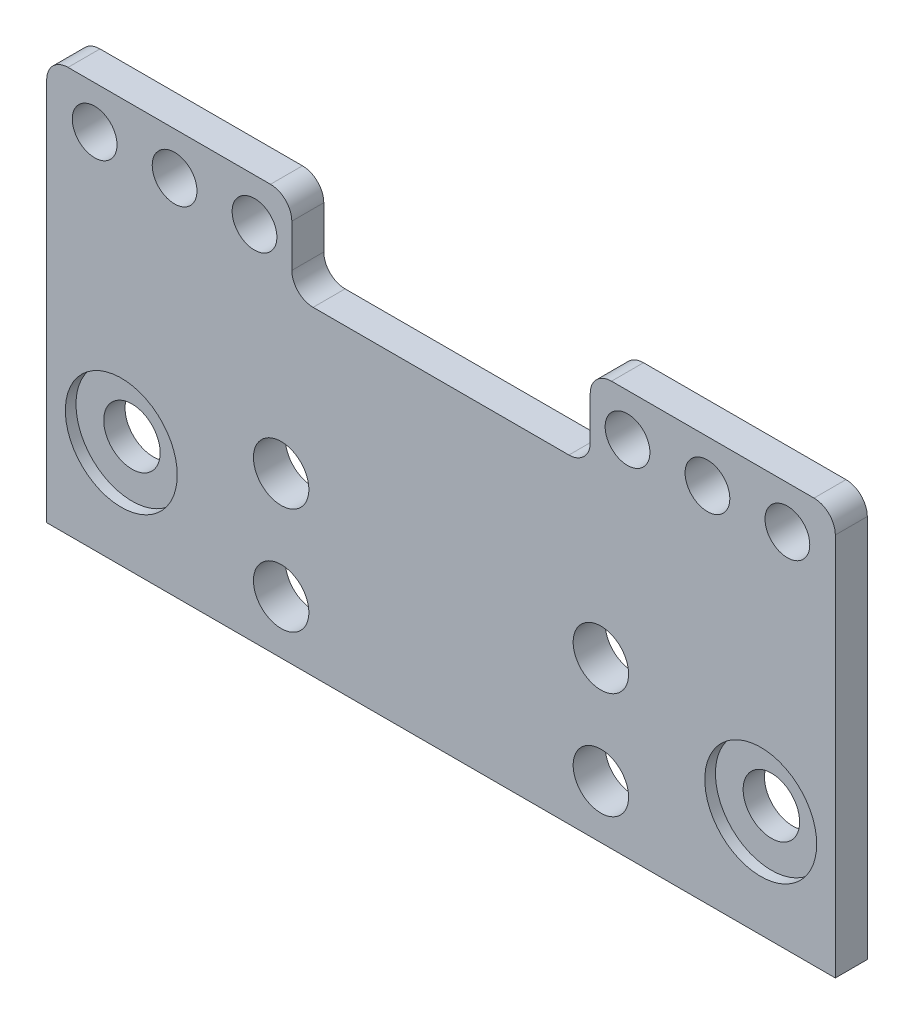
ISO-10303-21;
HEADER;
FILE_DESCRIPTION(('STEP AP214'),'2;1');
FILE_NAME('part.step','',(''),(''),'','','');
FILE_SCHEMA(('AUTOMOTIVE_DESIGN { 1 0 10303 214 1 1 1 1 }'));
ENDSEC;
DATA;
#1=APPLICATION_CONTEXT('core data for automotive mechanical design processes');
#2=APPLICATION_PROTOCOL_DEFINITION('international standard','automotive_design',2000,#1);
#3=PRODUCT_CONTEXT('',#1,'mechanical');
#4=PRODUCT('Part','Part','',(#3));
#5=PRODUCT_RELATED_PRODUCT_CATEGORY('part','',(#4));
#6=PRODUCT_DEFINITION_FORMATION('','',#4);
#7=PRODUCT_DEFINITION_CONTEXT('part definition',#1,'design');
#8=PRODUCT_DEFINITION('design','',#6,#7);
#9=PRODUCT_DEFINITION_SHAPE('','',#8);
#10=(LENGTH_UNIT() NAMED_UNIT(*) SI_UNIT(.MILLI.,.METRE.));
#11=(NAMED_UNIT(*) PLANE_ANGLE_UNIT() SI_UNIT($,.RADIAN.));
#12=(NAMED_UNIT(*) SI_UNIT($,.STERADIAN.) SOLID_ANGLE_UNIT());
#13=UNCERTAINTY_MEASURE_WITH_UNIT(LENGTH_MEASURE(1.E-05),#10,'distance_accuracy_value','');
#14=(GEOMETRIC_REPRESENTATION_CONTEXT(3) GLOBAL_UNCERTAINTY_ASSIGNED_CONTEXT((#13)) GLOBAL_UNIT_ASSIGNED_CONTEXT((#10,
#11,#12)) REPRESENTATION_CONTEXT('',''));
#15=CARTESIAN_POINT('',(0.,0.,0.));
#16=DIRECTION('',(0.,0.,1.));
#17=DIRECTION('',(1.,0.,0.));
#18=AXIS2_PLACEMENT_3D('',#15,#16,#17);
#19=CARTESIAN_POINT('',(-30.,0.,3.));
#20=DIRECTION('',(0.,0.,-1.));
#21=DIRECTION('',(-1.,0.,0.));
#22=AXIS2_PLACEMENT_3D('',#19,#20,#21);
#23=CYLINDRICAL_SURFACE('',#22,2.65);
#24=CARTESIAN_POINT('',(-30.,0.,0.));
#25=DIRECTION('',(0.,0.,1.));
#26=DIRECTION('',(1.,0.,0.));
#27=AXIS2_PLACEMENT_3D('',#24,#25,#26);
#28=CIRCLE('',#27,2.65);
#29=CARTESIAN_POINT('',(-27.35,0.,0.));
#30=VERTEX_POINT('',#29);
#31=EDGE_CURVE('E287',#30,#30,#28,.T.);
#32=ORIENTED_EDGE('',*,*,#31,.F.);
#33=EDGE_LOOP('',(#32));
#34=FACE_BOUND('',#33,.T.);
#35=CARTESIAN_POINT('',(-30.,0.,2.));
#36=DIRECTION('',(0.,0.,1.));
#37=DIRECTION('',(1.,0.,0.));
#38=AXIS2_PLACEMENT_3D('',#35,#36,#37);
#39=CIRCLE('',#38,2.65);
#40=CARTESIAN_POINT('',(-27.35,0.,2.));
#41=VERTEX_POINT('',#40);
#42=EDGE_CURVE('E39',#41,#41,#39,.T.);
#43=ORIENTED_EDGE('',*,*,#42,.T.);
#44=EDGE_LOOP('',(#43));
#45=FACE_BOUND('',#44,.T.);
#46=ADVANCED_FACE('F35',(#34,#45),#23,.F.);
#47=CARTESIAN_POINT('',(30.,0.,3.));
#48=DIRECTION('',(0.,0.,-1.));
#49=DIRECTION('',(-1.,0.,0.));
#50=AXIS2_PLACEMENT_3D('',#47,#48,#49);
#51=CYLINDRICAL_SURFACE('',#50,2.65);
#52=CARTESIAN_POINT('',(30.,0.,0.));
#53=DIRECTION('',(0.,0.,1.));
#54=DIRECTION('',(1.,0.,0.));
#55=AXIS2_PLACEMENT_3D('',#52,#53,#54);
#56=CIRCLE('',#55,2.65);
#57=CARTESIAN_POINT('',(32.65,0.,0.));
#58=VERTEX_POINT('',#57);
#59=EDGE_CURVE('E282',#58,#58,#56,.T.);
#60=ORIENTED_EDGE('',*,*,#59,.F.);
#61=EDGE_LOOP('',(#60));
#62=FACE_BOUND('',#61,.T.);
#63=CARTESIAN_POINT('',(30.,0.,2.));
#64=DIRECTION('',(0.,0.,1.));
#65=DIRECTION('',(1.,0.,0.));
#66=AXIS2_PLACEMENT_3D('',#63,#64,#65);
#67=CIRCLE('',#66,2.65);
#68=CARTESIAN_POINT('',(32.65,0.,2.));
#69=VERTEX_POINT('',#68);
#70=EDGE_CURVE('E244',#69,#69,#67,.T.);
#71=ORIENTED_EDGE('',*,*,#70,.T.);
#72=EDGE_LOOP('',(#71));
#73=FACE_BOUND('',#72,.T.);
#74=ADVANCED_FACE('F386',(#62,#73),#51,.F.);
#75=CARTESIAN_POINT('',(0.,0.,3.));
#76=DIRECTION('',(0.,0.,1.));
#77=DIRECTION('',(1.,0.,0.));
#78=AXIS2_PLACEMENT_3D('',#75,#76,#77);
#79=PLANE('',#78);
#80=CARTESIAN_POINT('',(-30.,0.,3.));
#81=DIRECTION('',(0.,0.,1.));
#82=DIRECTION('',(1.,0.,0.));
#83=AXIS2_PLACEMENT_3D('',#80,#81,#82);
#84=CIRCLE('',#83,5.25);
#85=CARTESIAN_POINT('',(-24.75,0.,3.));
#86=VERTEX_POINT('',#85);
#87=EDGE_CURVE('E261',#86,#86,#84,.T.);
#88=ORIENTED_EDGE('',*,*,#87,.F.);
#89=EDGE_LOOP('',(#88));
#90=FACE_BOUND('',#89,.T.);
#91=CARTESIAN_POINT('',(30.,0.,3.));
#92=DIRECTION('',(0.,0.,1.));
#93=DIRECTION('',(1.,0.,0.));
#94=AXIS2_PLACEMENT_3D('',#91,#92,#93);
#95=CIRCLE('',#94,5.25);
#96=CARTESIAN_POINT('',(35.25,0.,3.));
#97=VERTEX_POINT('',#96);
#98=EDGE_CURVE('E254',#97,#97,#95,.T.);
#99=ORIENTED_EDGE('',*,*,#98,.F.);
#100=EDGE_LOOP('',(#99));
#101=FACE_BOUND('',#100,.T.);
#102=CARTESIAN_POINT('',(-15.,5.,3.));
#103=DIRECTION('',(0.,0.,1.));
#104=DIRECTION('',(-1.,0.,0.));
#105=AXIS2_PLACEMENT_3D('',#102,#103,#104);
#106=CIRCLE('',#105,2.6);
#107=CARTESIAN_POINT('',(-17.6,5.,3.));
#108=VERTEX_POINT('',#107);
#109=EDGE_CURVE('E267',#108,#108,#106,.T.);
#110=ORIENTED_EDGE('',*,*,#109,.F.);
#111=EDGE_LOOP('',(#110));
#112=FACE_BOUND('',#111,.T.);
#113=CARTESIAN_POINT('',(15.,-5.,3.));
#114=DIRECTION('',(0.,0.,1.));
#115=DIRECTION('',(1.,0.,0.));
#116=AXIS2_PLACEMENT_3D('',#113,#114,#115);
#117=CIRCLE('',#116,2.6);
#118=CARTESIAN_POINT('',(17.6,-5.,3.));
#119=VERTEX_POINT('',#118);
#120=EDGE_CURVE('E279',#119,#119,#117,.T.);
#121=ORIENTED_EDGE('',*,*,#120,.F.);
#122=EDGE_LOOP('',(#121));
#123=FACE_BOUND('',#122,.T.);
#124=CARTESIAN_POINT('',(-17.5,24.,3.));
#125=DIRECTION('',(0.,0.,1.));
#126=DIRECTION('',(-1.,0.,0.));
#127=AXIS2_PLACEMENT_3D('',#124,#125,#126);
#128=CIRCLE('',#127,2.1);
#129=CARTESIAN_POINT('',(-19.6,24.,3.));
#130=VERTEX_POINT('',#129);
#131=EDGE_CURVE('E297',#130,#130,#128,.T.);
#132=ORIENTED_EDGE('',*,*,#131,.F.);
#133=EDGE_LOOP('',(#132));
#134=FACE_BOUND('',#133,.T.);
#135=CARTESIAN_POINT('',(32.5,24.,3.));
#136=DIRECTION('',(0.,0.,1.));
#137=DIRECTION('',(1.,0.,0.));
#138=AXIS2_PLACEMENT_3D('',#135,#136,#137);
#139=CIRCLE('',#138,2.1);
#140=CARTESIAN_POINT('',(34.6,24.,3.));
#141=VERTEX_POINT('',#140);
#142=EDGE_CURVE('E309',#141,#141,#139,.T.);
#143=ORIENTED_EDGE('',*,*,#142,.F.);
#144=EDGE_LOOP('',(#143));
#145=FACE_BOUND('',#144,.T.);
#146=CARTESIAN_POINT('',(17.5,24.,3.));
#147=DIRECTION('',(0.,0.,1.));
#148=DIRECTION('',(1.,0.,0.));
#149=AXIS2_PLACEMENT_3D('',#146,#147,#148);
#150=CIRCLE('',#149,2.1);
#151=CARTESIAN_POINT('',(19.6,24.,3.));
#152=VERTEX_POINT('',#151);
#153=EDGE_CURVE('E180',#152,#152,#150,.T.);
#154=ORIENTED_EDGE('',*,*,#153,.F.);
#155=EDGE_LOOP('',(#154));
#156=FACE_BOUND('',#155,.T.);
#157=DIRECTION('',(0.,1.,0.));
#158=VECTOR('',#157,1.);
#159=CARTESIAN_POINT('',(-14.,28.,3.));
#160=LINE('',#159,#158);
#161=CARTESIAN_POINT('',(-14.,22.,3.));
#162=VERTEX_POINT('',#161);
#163=CARTESIAN_POINT('',(-14.,26.,3.));
#164=VERTEX_POINT('',#163);
#165=EDGE_CURVE('E327',#162,#164,#160,.T.);
#166=ORIENTED_EDGE('',*,*,#165,.T.);
#167=CARTESIAN_POINT('',(-16.,26.,3.));
#168=DIRECTION('',(0.,0.,1.));
#169=DIRECTION('',(1.,0.,0.));
#170=AXIS2_PLACEMENT_3D('',#167,#168,#169);
#171=CIRCLE('',#170,2.);
#172=CARTESIAN_POINT('',(-16.,28.,3.));
#173=VERTEX_POINT('',#172);
#174=EDGE_CURVE('E220',#164,#173,#171,.T.);
#175=ORIENTED_EDGE('',*,*,#174,.T.);
#176=DIRECTION('',(-1.,0.,0.));
#177=VECTOR('',#176,1.);
#178=CARTESIAN_POINT('',(-37.,28.,3.));
#179=LINE('',#178,#177);
#180=CARTESIAN_POINT('',(-35.,28.,3.));
#181=VERTEX_POINT('',#180);
#182=EDGE_CURVE('E152',#173,#181,#179,.T.);
#183=ORIENTED_EDGE('',*,*,#182,.T.);
#184=CARTESIAN_POINT('',(-35.,26.,3.));
#185=DIRECTION('',(0.,0.,1.));
#186=DIRECTION('',(1.,0.,0.));
#187=AXIS2_PLACEMENT_3D('',#184,#185,#186);
#188=CIRCLE('',#187,2.);
#189=CARTESIAN_POINT('',(-37.,26.,3.));
#190=VERTEX_POINT('',#189);
#191=EDGE_CURVE('E148',#181,#190,#188,.T.);
#192=ORIENTED_EDGE('',*,*,#191,.T.);
#193=DIRECTION('',(0.,-1.,0.));
#194=VECTOR('',#193,1.);
#195=CARTESIAN_POINT('',(-37.,-10.,3.));
#196=LINE('',#195,#194);
#197=CARTESIAN_POINT('',(-37.,-10.,3.));
#198=VERTEX_POINT('',#197);
#199=EDGE_CURVE('E137',#190,#198,#196,.T.);
#200=ORIENTED_EDGE('',*,*,#199,.T.);
#201=DIRECTION('',(1.,0.,0.));
#202=VECTOR('',#201,1.);
#203=CARTESIAN_POINT('',(37.,-10.,3.));
#204=LINE('',#203,#202);
#205=CARTESIAN_POINT('',(37.,-10.,3.));
#206=VERTEX_POINT('',#205);
#207=EDGE_CURVE('E144',#198,#206,#204,.T.);
#208=ORIENTED_EDGE('',*,*,#207,.T.);
#209=DIRECTION('',(0.,1.,0.));
#210=VECTOR('',#209,1.);
#211=CARTESIAN_POINT('',(37.,28.,3.));
#212=LINE('',#211,#210);
#213=CARTESIAN_POINT('',(37.,26.,3.));
#214=VERTEX_POINT('',#213);
#215=EDGE_CURVE('E167',#206,#214,#212,.T.);
#216=ORIENTED_EDGE('',*,*,#215,.T.);
#217=CARTESIAN_POINT('',(35.,26.,3.));
#218=DIRECTION('',(0.,0.,1.));
#219=DIRECTION('',(1.,0.,0.));
#220=AXIS2_PLACEMENT_3D('',#217,#218,#219);
#221=CIRCLE('',#220,2.);
#222=CARTESIAN_POINT('',(35.,28.,3.));
#223=VERTEX_POINT('',#222);
#224=EDGE_CURVE('E216',#214,#223,#221,.T.);
#225=ORIENTED_EDGE('',*,*,#224,.T.);
#226=DIRECTION('',(-1.,0.,0.));
#227=VECTOR('',#226,1.);
#228=CARTESIAN_POINT('',(14.,28.,3.));
#229=LINE('',#228,#227);
#230=CARTESIAN_POINT('',(16.,28.,3.));
#231=VERTEX_POINT('',#230);
#232=EDGE_CURVE('E169',#223,#231,#229,.T.);
#233=ORIENTED_EDGE('',*,*,#232,.T.);
#234=CARTESIAN_POINT('',(16.,26.,3.));
#235=DIRECTION('',(0.,0.,1.));
#236=DIRECTION('',(1.,0.,0.));
#237=AXIS2_PLACEMENT_3D('',#234,#235,#236);
#238=CIRCLE('',#237,2.);
#239=CARTESIAN_POINT('',(14.,26.,3.));
#240=VERTEX_POINT('',#239);
#241=EDGE_CURVE('E59',#231,#240,#238,.T.);
#242=ORIENTED_EDGE('',*,*,#241,.T.);
#243=DIRECTION('',(0.,-1.,0.));
#244=VECTOR('',#243,1.);
#245=CARTESIAN_POINT('',(14.,20.,3.));
#246=LINE('',#245,#244);
#247=CARTESIAN_POINT('',(14.,22.,3.));
#248=VERTEX_POINT('',#247);
#249=EDGE_CURVE('E174',#240,#248,#246,.T.);
#250=ORIENTED_EDGE('',*,*,#249,.T.);
#251=CARTESIAN_POINT('',(12.,22.,3.));
#252=DIRECTION('',(0.,0.,1.));
#253=DIRECTION('',(1.,0.,0.));
#254=AXIS2_PLACEMENT_3D('',#251,#252,#253);
#255=CIRCLE('',#254,2.);
#256=CARTESIAN_POINT('',(12.,20.,3.));
#257=VERTEX_POINT('',#256);
#258=EDGE_CURVE('E242',#248,#257,#255,.F.);
#259=ORIENTED_EDGE('',*,*,#258,.T.);
#260=DIRECTION('',(-1.,0.,0.));
#261=VECTOR('',#260,1.);
#262=CARTESIAN_POINT('',(-14.,20.,3.));
#263=LINE('',#262,#261);
#264=CARTESIAN_POINT('',(-12.,20.,3.));
#265=VERTEX_POINT('',#264);
#266=EDGE_CURVE('E197',#257,#265,#263,.T.);
#267=ORIENTED_EDGE('',*,*,#266,.T.);
#268=CARTESIAN_POINT('',(-12.,22.,3.));
#269=DIRECTION('',(0.,0.,1.));
#270=DIRECTION('',(1.,0.,0.));
#271=AXIS2_PLACEMENT_3D('',#268,#269,#270);
#272=CIRCLE('',#271,2.);
#273=EDGE_CURVE('E11',#265,#162,#272,.F.);
#274=ORIENTED_EDGE('',*,*,#273,.T.);
#275=EDGE_LOOP('',(#166,#175,#183,#192,#200,#208,#216,#225,#233,#242,#250,#259,#267,#274));
#276=FACE_BOUND('',#275,.T.);
#277=CARTESIAN_POINT('',(25.,24.,3.));
#278=DIRECTION('',(0.,0.,1.));
#279=DIRECTION('',(1.,0.,0.));
#280=AXIS2_PLACEMENT_3D('',#277,#278,#279);
#281=CIRCLE('',#280,2.1);
#282=CARTESIAN_POINT('',(27.1,24.,3.));
#283=VERTEX_POINT('',#282);
#284=EDGE_CURVE('E315',#283,#283,#281,.T.);
#285=ORIENTED_EDGE('',*,*,#284,.F.);
#286=EDGE_LOOP('',(#285));
#287=FACE_BOUND('',#286,.T.);
#288=CARTESIAN_POINT('',(-32.5,24.,3.));
#289=DIRECTION('',(0.,0.,1.));
#290=DIRECTION('',(-1.,0.,0.));
#291=AXIS2_PLACEMENT_3D('',#288,#289,#290);
#292=CIRCLE('',#291,2.1);
#293=CARTESIAN_POINT('',(-34.6,24.,3.));
#294=VERTEX_POINT('',#293);
#295=EDGE_CURVE('E303',#294,#294,#292,.T.);
#296=ORIENTED_EDGE('',*,*,#295,.F.);
#297=EDGE_LOOP('',(#296));
#298=FACE_BOUND('',#297,.T.);
#299=CARTESIAN_POINT('',(-25.,24.,3.));
#300=DIRECTION('',(0.,0.,1.));
#301=DIRECTION('',(-1.,0.,0.));
#302=AXIS2_PLACEMENT_3D('',#299,#300,#301);
#303=CIRCLE('',#302,2.1);
#304=CARTESIAN_POINT('',(-27.1,24.,3.));
#305=VERTEX_POINT('',#304);
#306=EDGE_CURVE('E291',#305,#305,#303,.T.);
#307=ORIENTED_EDGE('',*,*,#306,.F.);
#308=EDGE_LOOP('',(#307));
#309=FACE_BOUND('',#308,.T.);
#310=CARTESIAN_POINT('',(15.,5.,3.));
#311=DIRECTION('',(0.,0.,1.));
#312=DIRECTION('',(1.,0.,0.));
#313=AXIS2_PLACEMENT_3D('',#310,#311,#312);
#314=CIRCLE('',#313,2.6);
#315=CARTESIAN_POINT('',(17.6,5.,3.));
#316=VERTEX_POINT('',#315);
#317=EDGE_CURVE('E273',#316,#316,#314,.T.);
#318=ORIENTED_EDGE('',*,*,#317,.F.);
#319=EDGE_LOOP('',(#318));
#320=FACE_BOUND('',#319,.T.);
#321=CARTESIAN_POINT('',(-15.,-5.,3.));
#322=DIRECTION('',(0.,0.,1.));
#323=DIRECTION('',(-1.,0.,0.));
#324=AXIS2_PLACEMENT_3D('',#321,#322,#323);
#325=CIRCLE('',#324,2.6);
#326=CARTESIAN_POINT('',(-17.6,-5.,3.));
#327=VERTEX_POINT('',#326);
#328=EDGE_CURVE('E251',#327,#327,#325,.T.);
#329=ORIENTED_EDGE('',*,*,#328,.F.);
#330=EDGE_LOOP('',(#329));
#331=FACE_BOUND('',#330,.T.);
#332=ADVANCED_FACE('F140',(#90,#101,#112,#123,#134,#145,#156,#276,#287,#298,#309,#320,#331),#79,.T.);
#333=CARTESIAN_POINT('',(0.,0.,0.));
#334=DIRECTION('',(0.,0.,1.));
#335=DIRECTION('',(1.,0.,0.));
#336=AXIS2_PLACEMENT_3D('',#333,#334,#335);
#337=PLANE('',#336);
#338=DIRECTION('',(-1.,0.,0.));
#339=VECTOR('',#338,1.);
#340=CARTESIAN_POINT('',(-37.,28.,0.));
#341=LINE('',#340,#339);
#342=CARTESIAN_POINT('',(-16.,28.,0.));
#343=VERTEX_POINT('',#342);
#344=CARTESIAN_POINT('',(-35.,28.,0.));
#345=VERTEX_POINT('',#344);
#346=EDGE_CURVE('E183',#343,#345,#341,.T.);
#347=ORIENTED_EDGE('',*,*,#346,.F.);
#348=CARTESIAN_POINT('',(-16.,26.,0.));
#349=DIRECTION('',(0.,0.,1.));
#350=DIRECTION('',(1.,0.,0.));
#351=AXIS2_PLACEMENT_3D('',#348,#349,#350);
#352=CIRCLE('',#351,2.);
#353=CARTESIAN_POINT('',(-14.,26.,0.));
#354=VERTEX_POINT('',#353);
#355=EDGE_CURVE('E209',#343,#354,#352,.F.);
#356=ORIENTED_EDGE('',*,*,#355,.T.);
#357=DIRECTION('',(0.,1.,0.));
#358=VECTOR('',#357,1.);
#359=CARTESIAN_POINT('',(-14.,28.,0.));
#360=LINE('',#359,#358);
#361=CARTESIAN_POINT('',(-14.,22.,0.));
#362=VERTEX_POINT('',#361);
#363=EDGE_CURVE('E179',#362,#354,#360,.T.);
#364=ORIENTED_EDGE('',*,*,#363,.F.);
#365=CARTESIAN_POINT('',(-12.,22.,0.));
#366=DIRECTION('',(0.,0.,1.));
#367=DIRECTION('',(1.,0.,0.));
#368=AXIS2_PLACEMENT_3D('',#365,#366,#367);
#369=CIRCLE('',#368,2.);
#370=CARTESIAN_POINT('',(-12.,20.,0.));
#371=VERTEX_POINT('',#370);
#372=EDGE_CURVE('E44',#362,#371,#369,.T.);
#373=ORIENTED_EDGE('',*,*,#372,.T.);
#374=DIRECTION('',(-1.,0.,0.));
#375=VECTOR('',#374,1.);
#376=CARTESIAN_POINT('',(-14.,20.,0.));
#377=LINE('',#376,#375);
#378=CARTESIAN_POINT('',(12.,20.,0.));
#379=VERTEX_POINT('',#378);
#380=EDGE_CURVE('E176',#379,#371,#377,.T.);
#381=ORIENTED_EDGE('',*,*,#380,.F.);
#382=CARTESIAN_POINT('',(12.,22.,0.));
#383=DIRECTION('',(0.,0.,1.));
#384=DIRECTION('',(1.,0.,0.));
#385=AXIS2_PLACEMENT_3D('',#382,#383,#384);
#386=CIRCLE('',#385,2.);
#387=CARTESIAN_POINT('',(14.,22.,0.));
#388=VERTEX_POINT('',#387);
#389=EDGE_CURVE('E240',#379,#388,#386,.T.);
#390=ORIENTED_EDGE('',*,*,#389,.T.);
#391=DIRECTION('',(0.,-1.,0.));
#392=VECTOR('',#391,1.);
#393=CARTESIAN_POINT('',(14.,20.,0.));
#394=LINE('',#393,#392);
#395=CARTESIAN_POINT('',(14.,26.,0.));
#396=VERTEX_POINT('',#395);
#397=EDGE_CURVE('E195',#396,#388,#394,.T.);
#398=ORIENTED_EDGE('',*,*,#397,.F.);
#399=CARTESIAN_POINT('',(16.,26.,0.));
#400=DIRECTION('',(0.,0.,1.));
#401=DIRECTION('',(1.,0.,0.));
#402=AXIS2_PLACEMENT_3D('',#399,#400,#401);
#403=CIRCLE('',#402,2.);
#404=CARTESIAN_POINT('',(16.,28.,0.));
#405=VERTEX_POINT('',#404);
#406=EDGE_CURVE('E207',#396,#405,#403,.F.);
#407=ORIENTED_EDGE('',*,*,#406,.T.);
#408=DIRECTION('',(-1.,0.,0.));
#409=VECTOR('',#408,1.);
#410=CARTESIAN_POINT('',(14.,28.,0.));
#411=LINE('',#410,#409);
#412=CARTESIAN_POINT('',(35.,28.,0.));
#413=VERTEX_POINT('',#412);
#414=EDGE_CURVE('E192',#413,#405,#411,.T.);
#415=ORIENTED_EDGE('',*,*,#414,.F.);
#416=CARTESIAN_POINT('',(35.,26.,0.));
#417=DIRECTION('',(0.,0.,1.));
#418=DIRECTION('',(1.,0.,0.));
#419=AXIS2_PLACEMENT_3D('',#416,#417,#418);
#420=CIRCLE('',#419,2.);
#421=CARTESIAN_POINT('',(37.,26.,0.));
#422=VERTEX_POINT('',#421);
#423=EDGE_CURVE('E203',#413,#422,#420,.F.);
#424=ORIENTED_EDGE('',*,*,#423,.T.);
#425=DIRECTION('',(0.,1.,0.));
#426=VECTOR('',#425,1.);
#427=CARTESIAN_POINT('',(37.,28.,0.));
#428=LINE('',#427,#426);
#429=CARTESIAN_POINT('',(37.,-10.,0.));
#430=VERTEX_POINT('',#429);
#431=EDGE_CURVE('E189',#430,#422,#428,.T.);
#432=ORIENTED_EDGE('',*,*,#431,.F.);
#433=DIRECTION('',(1.,0.,0.));
#434=VECTOR('',#433,1.);
#435=CARTESIAN_POINT('',(37.,-10.,0.));
#436=LINE('',#435,#434);
#437=CARTESIAN_POINT('',(-37.,-10.,0.));
#438=VERTEX_POINT('',#437);
#439=EDGE_CURVE('E187',#438,#430,#436,.T.);
#440=ORIENTED_EDGE('',*,*,#439,.F.);
#441=DIRECTION('',(0.,-1.,0.));
#442=VECTOR('',#441,1.);
#443=CARTESIAN_POINT('',(-37.,-10.,0.));
#444=LINE('',#443,#442);
#445=CARTESIAN_POINT('',(-37.,26.,0.));
#446=VERTEX_POINT('',#445);
#447=EDGE_CURVE('E158',#446,#438,#444,.T.);
#448=ORIENTED_EDGE('',*,*,#447,.F.);
#449=CARTESIAN_POINT('',(-35.,26.,0.));
#450=DIRECTION('',(0.,0.,1.));
#451=DIRECTION('',(1.,0.,0.));
#452=AXIS2_PLACEMENT_3D('',#449,#450,#451);
#453=CIRCLE('',#452,2.);
#454=EDGE_CURVE('E205',#446,#345,#453,.F.);
#455=ORIENTED_EDGE('',*,*,#454,.T.);
#456=EDGE_LOOP('',(#347,#356,#364,#373,#381,#390,#398,#407,#415,#424,#432,#440,#448,#455));
#457=FACE_BOUND('',#456,.T.);
#458=CARTESIAN_POINT('',(17.5,24.,0.));
#459=DIRECTION('',(0.,0.,1.));
#460=DIRECTION('',(1.,0.,0.));
#461=AXIS2_PLACEMENT_3D('',#458,#459,#460);
#462=CIRCLE('',#461,2.1);
#463=CARTESIAN_POINT('',(19.6,24.,0.));
#464=VERTEX_POINT('',#463);
#465=EDGE_CURVE('E318',#464,#464,#462,.T.);
#466=ORIENTED_EDGE('',*,*,#465,.T.);
#467=EDGE_LOOP('',(#466));
#468=FACE_BOUND('',#467,.T.);
#469=CARTESIAN_POINT('',(25.,24.,0.));
#470=DIRECTION('',(0.,0.,1.));
#471=DIRECTION('',(1.,0.,0.));
#472=AXIS2_PLACEMENT_3D('',#469,#470,#471);
#473=CIRCLE('',#472,2.1);
#474=CARTESIAN_POINT('',(27.1,24.,0.));
#475=VERTEX_POINT('',#474);
#476=EDGE_CURVE('E312',#475,#475,#473,.T.);
#477=ORIENTED_EDGE('',*,*,#476,.T.);
#478=EDGE_LOOP('',(#477));
#479=FACE_BOUND('',#478,.T.);
#480=CARTESIAN_POINT('',(32.5,24.,0.));
#481=DIRECTION('',(0.,0.,1.));
#482=DIRECTION('',(1.,0.,0.));
#483=AXIS2_PLACEMENT_3D('',#480,#481,#482);
#484=CIRCLE('',#483,2.1);
#485=CARTESIAN_POINT('',(34.6,24.,0.));
#486=VERTEX_POINT('',#485);
#487=EDGE_CURVE('E306',#486,#486,#484,.T.);
#488=ORIENTED_EDGE('',*,*,#487,.T.);
#489=EDGE_LOOP('',(#488));
#490=FACE_BOUND('',#489,.T.);
#491=CARTESIAN_POINT('',(-32.5,24.,0.));
#492=DIRECTION('',(0.,0.,1.));
#493=DIRECTION('',(-1.,0.,0.));
#494=AXIS2_PLACEMENT_3D('',#491,#492,#493);
#495=CIRCLE('',#494,2.1);
#496=CARTESIAN_POINT('',(-34.6,24.,0.));
#497=VERTEX_POINT('',#496);
#498=EDGE_CURVE('E300',#497,#497,#495,.T.);
#499=ORIENTED_EDGE('',*,*,#498,.T.);
#500=EDGE_LOOP('',(#499));
#501=FACE_BOUND('',#500,.T.);
#502=CARTESIAN_POINT('',(-17.5,24.,0.));
#503=DIRECTION('',(0.,0.,1.));
#504=DIRECTION('',(-1.,0.,0.));
#505=AXIS2_PLACEMENT_3D('',#502,#503,#504);
#506=CIRCLE('',#505,2.1);
#507=CARTESIAN_POINT('',(-19.6,24.,0.));
#508=VERTEX_POINT('',#507);
#509=EDGE_CURVE('E294',#508,#508,#506,.T.);
#510=ORIENTED_EDGE('',*,*,#509,.T.);
#511=EDGE_LOOP('',(#510));
#512=FACE_BOUND('',#511,.T.);
#513=CARTESIAN_POINT('',(-25.,24.,0.));
#514=DIRECTION('',(0.,0.,1.));
#515=DIRECTION('',(-1.,0.,0.));
#516=AXIS2_PLACEMENT_3D('',#513,#514,#515);
#517=CIRCLE('',#516,2.1);
#518=CARTESIAN_POINT('',(-27.1,24.,0.));
#519=VERTEX_POINT('',#518);
#520=EDGE_CURVE('E290',#519,#519,#517,.T.);
#521=ORIENTED_EDGE('',*,*,#520,.T.);
#522=EDGE_LOOP('',(#521));
#523=FACE_BOUND('',#522,.T.);
#524=ORIENTED_EDGE('',*,*,#31,.T.);
#525=EDGE_LOOP('',(#524));
#526=FACE_BOUND('',#525,.T.);
#527=ORIENTED_EDGE('',*,*,#59,.T.);
#528=EDGE_LOOP('',(#527));
#529=FACE_BOUND('',#528,.T.);
#530=CARTESIAN_POINT('',(15.,-5.,0.));
#531=DIRECTION('',(0.,0.,1.));
#532=DIRECTION('',(1.,0.,0.));
#533=AXIS2_PLACEMENT_3D('',#530,#531,#532);
#534=CIRCLE('',#533,2.6);
#535=CARTESIAN_POINT('',(17.6,-5.,0.));
#536=VERTEX_POINT('',#535);
#537=EDGE_CURVE('E276',#536,#536,#534,.T.);
#538=ORIENTED_EDGE('',*,*,#537,.T.);
#539=EDGE_LOOP('',(#538));
#540=FACE_BOUND('',#539,.T.);
#541=CARTESIAN_POINT('',(15.,5.,0.));
#542=DIRECTION('',(0.,0.,1.));
#543=DIRECTION('',(1.,0.,0.));
#544=AXIS2_PLACEMENT_3D('',#541,#542,#543);
#545=CIRCLE('',#544,2.6);
#546=CARTESIAN_POINT('',(17.6,5.,0.));
#547=VERTEX_POINT('',#546);
#548=EDGE_CURVE('E270',#547,#547,#545,.T.);
#549=ORIENTED_EDGE('',*,*,#548,.T.);
#550=EDGE_LOOP('',(#549));
#551=FACE_BOUND('',#550,.T.);
#552=CARTESIAN_POINT('',(-15.,5.,0.));
#553=DIRECTION('',(0.,0.,1.));
#554=DIRECTION('',(-1.,0.,0.));
#555=AXIS2_PLACEMENT_3D('',#552,#553,#554);
#556=CIRCLE('',#555,2.6);
#557=CARTESIAN_POINT('',(-17.6,5.,0.));
#558=VERTEX_POINT('',#557);
#559=EDGE_CURVE('E265',#558,#558,#556,.T.);
#560=ORIENTED_EDGE('',*,*,#559,.T.);
#561=EDGE_LOOP('',(#560));
#562=FACE_BOUND('',#561,.T.);
#563=CARTESIAN_POINT('',(-15.,-5.,0.));
#564=DIRECTION('',(0.,0.,1.));
#565=DIRECTION('',(-1.,0.,0.));
#566=AXIS2_PLACEMENT_3D('',#563,#564,#565);
#567=CIRCLE('',#566,2.6);
#568=CARTESIAN_POINT('',(-17.6,-5.,0.));
#569=VERTEX_POINT('',#568);
#570=EDGE_CURVE('E246',#569,#569,#567,.T.);
#571=ORIENTED_EDGE('',*,*,#570,.T.);
#572=EDGE_LOOP('',(#571));
#573=FACE_BOUND('',#572,.T.);
#574=ADVANCED_FACE('F337',(#457,#468,#479,#490,#501,#512,#523,#526,#529,#540,#551,#562,#573),
#337,.F.);
#575=CARTESIAN_POINT('',(-14.,20.,3.));
#576=DIRECTION('',(0.,-1.,0.));
#577=DIRECTION('',(0.,0.,-1.));
#578=AXIS2_PLACEMENT_3D('',#575,#576,#577);
#579=PLANE('',#578);
#580=ORIENTED_EDGE('',*,*,#266,.F.);
#581=DIRECTION('',(0.,0.,-1.));
#582=VECTOR('',#581,1.);
#583=CARTESIAN_POINT('',(12.,20.,0.));
#584=LINE('',#583,#582);
#585=EDGE_CURVE('E233',#257,#379,#584,.T.);
#586=ORIENTED_EDGE('',*,*,#585,.T.);
#587=ORIENTED_EDGE('',*,*,#380,.T.);
#588=DIRECTION('',(0.,0.,-1.));
#589=VECTOR('',#588,1.);
#590=CARTESIAN_POINT('',(-12.,20.,3.));
#591=LINE('',#590,#589);
#592=EDGE_CURVE('E231',#371,#265,#591,.F.);
#593=ORIENTED_EDGE('',*,*,#592,.T.);
#594=EDGE_LOOP('',(#580,#586,#587,#593));
#595=FACE_BOUND('',#594,.T.);
#596=ADVANCED_FACE('F363',(#595),#579,.F.);
#597=CARTESIAN_POINT('',(-14.,28.,3.));
#598=DIRECTION('',(-1.,0.,0.));
#599=DIRECTION('',(0.,-1.,0.));
#600=AXIS2_PLACEMENT_3D('',#597,#598,#599);
#601=PLANE('',#600);
#602=ORIENTED_EDGE('',*,*,#363,.T.);
#603=DIRECTION('',(0.,0.,-1.));
#604=VECTOR('',#603,1.);
#605=CARTESIAN_POINT('',(-14.,26.,3.));
#606=LINE('',#605,#604);
#607=EDGE_CURVE('E214',#354,#164,#606,.F.);
#608=ORIENTED_EDGE('',*,*,#607,.T.);
#609=ORIENTED_EDGE('',*,*,#165,.F.);
#610=DIRECTION('',(0.,0.,-1.));
#611=VECTOR('',#610,1.);
#612=CARTESIAN_POINT('',(-14.,22.,0.));
#613=LINE('',#612,#611);
#614=EDGE_CURVE('E211',#162,#362,#613,.T.);
#615=ORIENTED_EDGE('',*,*,#614,.T.);
#616=EDGE_LOOP('',(#602,#608,#609,#615));
#617=FACE_BOUND('',#616,.T.);
#618=ADVANCED_FACE('F372',(#617),#601,.F.);
#619=CARTESIAN_POINT('',(-37.,28.,3.));
#620=DIRECTION('',(0.,-1.,0.));
#621=DIRECTION('',(0.,0.,-1.));
#622=AXIS2_PLACEMENT_3D('',#619,#620,#621);
#623=PLANE('',#622);
#624=ORIENTED_EDGE('',*,*,#182,.F.);
#625=DIRECTION('',(0.,0.,-1.));
#626=VECTOR('',#625,1.);
#627=CARTESIAN_POINT('',(-16.,28.,3.));
#628=LINE('',#627,#626);
#629=EDGE_CURVE('E200',#173,#343,#628,.T.);
#630=ORIENTED_EDGE('',*,*,#629,.T.);
#631=ORIENTED_EDGE('',*,*,#346,.T.);
#632=DIRECTION('',(0.,0.,-1.));
#633=VECTOR('',#632,1.);
#634=CARTESIAN_POINT('',(-35.,28.,3.));
#635=LINE('',#634,#633);
#636=EDGE_CURVE('E161',#345,#181,#635,.F.);
#637=ORIENTED_EDGE('',*,*,#636,.T.);
#638=EDGE_LOOP('',(#624,#630,#631,#637));
#639=FACE_BOUND('',#638,.T.);
#640=ADVANCED_FACE('F376',(#639),#623,.F.);
#641=CARTESIAN_POINT('',(-37.,-10.,3.));
#642=DIRECTION('',(1.,0.,0.));
#643=DIRECTION('',(0.,1.,0.));
#644=AXIS2_PLACEMENT_3D('',#641,#642,#643);
#645=PLANE('',#644);
#646=ORIENTED_EDGE('',*,*,#199,.F.);
#647=DIRECTION('',(0.,0.,-1.));
#648=VECTOR('',#647,1.);
#649=CARTESIAN_POINT('',(-37.,26.,3.));
#650=LINE('',#649,#648);
#651=EDGE_CURVE('E236',#190,#446,#650,.T.);
#652=ORIENTED_EDGE('',*,*,#651,.T.);
#653=ORIENTED_EDGE('',*,*,#447,.T.);
#654=DIRECTION('',(0.,0.,-1.));
#655=VECTOR('',#654,1.);
#656=CARTESIAN_POINT('',(-37.,-10.,3.));
#657=LINE('',#656,#655);
#658=EDGE_CURVE('E155',#198,#438,#657,.T.);
#659=ORIENTED_EDGE('',*,*,#658,.F.);
#660=EDGE_LOOP('',(#646,#652,#653,#659));
#661=FACE_BOUND('',#660,.T.);
#662=ADVANCED_FACE('F156',(#661),#645,.F.);
#663=CARTESIAN_POINT('',(37.,-10.,3.));
#664=DIRECTION('',(0.,1.,0.));
#665=DIRECTION('',(-1.,0.,0.));
#666=AXIS2_PLACEMENT_3D('',#663,#664,#665);
#667=PLANE('',#666);
#668=ORIENTED_EDGE('',*,*,#439,.T.);
#669=DIRECTION('',(0.,0.,-1.));
#670=VECTOR('',#669,1.);
#671=CARTESIAN_POINT('',(37.,-10.,3.));
#672=LINE('',#671,#670);
#673=EDGE_CURVE('E162',#206,#430,#672,.T.);
#674=ORIENTED_EDGE('',*,*,#673,.F.);
#675=ORIENTED_EDGE('',*,*,#207,.F.);
#676=ORIENTED_EDGE('',*,*,#658,.T.);
#677=EDGE_LOOP('',(#668,#674,#675,#676));
#678=FACE_BOUND('',#677,.T.);
#679=ADVANCED_FACE('F164',(#678),#667,.F.);
#680=CARTESIAN_POINT('',(37.,28.,3.));
#681=DIRECTION('',(-1.,0.,0.));
#682=DIRECTION('',(0.,-1.,0.));
#683=AXIS2_PLACEMENT_3D('',#680,#681,#682);
#684=PLANE('',#683);
#685=ORIENTED_EDGE('',*,*,#431,.T.);
#686=DIRECTION('',(0.,0.,-1.));
#687=VECTOR('',#686,1.);
#688=CARTESIAN_POINT('',(37.,26.,3.));
#689=LINE('',#688,#687);
#690=EDGE_CURVE('E238',#422,#214,#689,.F.);
#691=ORIENTED_EDGE('',*,*,#690,.T.);
#692=ORIENTED_EDGE('',*,*,#215,.F.);
#693=ORIENTED_EDGE('',*,*,#673,.T.);
#694=EDGE_LOOP('',(#685,#691,#692,#693));
#695=FACE_BOUND('',#694,.T.);
#696=ADVANCED_FACE('F341',(#695),#684,.F.);
#697=CARTESIAN_POINT('',(14.,28.,3.));
#698=DIRECTION('',(0.,-1.,0.));
#699=DIRECTION('',(0.,0.,-1.));
#700=AXIS2_PLACEMENT_3D('',#697,#698,#699);
#701=PLANE('',#700);
#702=ORIENTED_EDGE('',*,*,#414,.T.);
#703=DIRECTION('',(0.,0.,-1.));
#704=VECTOR('',#703,1.);
#705=CARTESIAN_POINT('',(16.,28.,3.));
#706=LINE('',#705,#704);
#707=EDGE_CURVE('E229',#405,#231,#706,.F.);
#708=ORIENTED_EDGE('',*,*,#707,.T.);
#709=ORIENTED_EDGE('',*,*,#232,.F.);
#710=DIRECTION('',(0.,0.,-1.));
#711=VECTOR('',#710,1.);
#712=CARTESIAN_POINT('',(35.,28.,3.));
#713=LINE('',#712,#711);
#714=EDGE_CURVE('E226',#223,#413,#713,.T.);
#715=ORIENTED_EDGE('',*,*,#714,.T.);
#716=EDGE_LOOP('',(#702,#708,#709,#715));
#717=FACE_BOUND('',#716,.T.);
#718=ADVANCED_FACE('F349',(#717),#701,.F.);
#719=CARTESIAN_POINT('',(14.,20.,3.));
#720=DIRECTION('',(1.,0.,0.));
#721=DIRECTION('',(0.,0.,-1.));
#722=AXIS2_PLACEMENT_3D('',#719,#720,#721);
#723=PLANE('',#722);
#724=ORIENTED_EDGE('',*,*,#249,.F.);
#725=DIRECTION('',(0.,0.,-1.));
#726=VECTOR('',#725,1.);
#727=CARTESIAN_POINT('',(14.,26.,3.));
#728=LINE('',#727,#726);
#729=EDGE_CURVE('E223',#240,#396,#728,.T.);
#730=ORIENTED_EDGE('',*,*,#729,.T.);
#731=ORIENTED_EDGE('',*,*,#397,.T.);
#732=DIRECTION('',(0.,0.,-1.));
#733=VECTOR('',#732,1.);
#734=CARTESIAN_POINT('',(14.,22.,3.));
#735=LINE('',#734,#733);
#736=EDGE_CURVE('E52',#388,#248,#735,.F.);
#737=ORIENTED_EDGE('',*,*,#736,.T.);
#738=EDGE_LOOP('',(#724,#730,#731,#737));
#739=FACE_BOUND('',#738,.T.);
#740=ADVANCED_FACE('F355',(#739),#723,.F.);
#741=CARTESIAN_POINT('',(17.5,24.,3.));
#742=DIRECTION('',(0.,0.,-1.));
#743=DIRECTION('',(-1.,0.,0.));
#744=AXIS2_PLACEMENT_3D('',#741,#742,#743);
#745=CYLINDRICAL_SURFACE('',#744,2.1);
#746=ORIENTED_EDGE('',*,*,#153,.T.);
#747=EDGE_LOOP('',(#746));
#748=FACE_BOUND('',#747,.T.);
#749=ORIENTED_EDGE('',*,*,#465,.F.);
#750=EDGE_LOOP('',(#749));
#751=FACE_BOUND('',#750,.T.);
#752=ADVANCED_FACE('F418',(#748,#751),#745,.F.);
#753=CARTESIAN_POINT('',(25.,24.,3.));
#754=DIRECTION('',(0.,0.,-1.));
#755=DIRECTION('',(-1.,0.,0.));
#756=AXIS2_PLACEMENT_3D('',#753,#754,#755);
#757=CYLINDRICAL_SURFACE('',#756,2.1);
#758=ORIENTED_EDGE('',*,*,#284,.T.);
#759=EDGE_LOOP('',(#758));
#760=FACE_BOUND('',#759,.T.);
#761=ORIENTED_EDGE('',*,*,#476,.F.);
#762=EDGE_LOOP('',(#761));
#763=FACE_BOUND('',#762,.T.);
#764=ADVANCED_FACE('F414',(#760,#763),#757,.F.);
#765=CARTESIAN_POINT('',(32.5,24.,3.));
#766=DIRECTION('',(0.,0.,-1.));
#767=DIRECTION('',(-1.,0.,0.));
#768=AXIS2_PLACEMENT_3D('',#765,#766,#767);
#769=CYLINDRICAL_SURFACE('',#768,2.1);
#770=ORIENTED_EDGE('',*,*,#142,.T.);
#771=EDGE_LOOP('',(#770));
#772=FACE_BOUND('',#771,.T.);
#773=ORIENTED_EDGE('',*,*,#487,.F.);
#774=EDGE_LOOP('',(#773));
#775=FACE_BOUND('',#774,.T.);
#776=ADVANCED_FACE('F410',(#772,#775),#769,.F.);
#777=CARTESIAN_POINT('',(-32.5,24.,3.));
#778=DIRECTION('',(0.,0.,-1.));
#779=DIRECTION('',(-1.,0.,0.));
#780=AXIS2_PLACEMENT_3D('',#777,#778,#779);
#781=CYLINDRICAL_SURFACE('',#780,2.1);
#782=ORIENTED_EDGE('',*,*,#295,.T.);
#783=EDGE_LOOP('',(#782));
#784=FACE_BOUND('',#783,.T.);
#785=ORIENTED_EDGE('',*,*,#498,.F.);
#786=EDGE_LOOP('',(#785));
#787=FACE_BOUND('',#786,.T.);
#788=ADVANCED_FACE('F406',(#784,#787),#781,.F.);
#789=CARTESIAN_POINT('',(-17.5,24.,3.));
#790=DIRECTION('',(0.,0.,-1.));
#791=DIRECTION('',(-1.,0.,0.));
#792=AXIS2_PLACEMENT_3D('',#789,#790,#791);
#793=CYLINDRICAL_SURFACE('',#792,2.1);
#794=ORIENTED_EDGE('',*,*,#131,.T.);
#795=EDGE_LOOP('',(#794));
#796=FACE_BOUND('',#795,.T.);
#797=ORIENTED_EDGE('',*,*,#509,.F.);
#798=EDGE_LOOP('',(#797));
#799=FACE_BOUND('',#798,.T.);
#800=ADVANCED_FACE('F402',(#796,#799),#793,.F.);
#801=CARTESIAN_POINT('',(-25.,24.,3.));
#802=DIRECTION('',(0.,0.,-1.));
#803=DIRECTION('',(-1.,0.,0.));
#804=AXIS2_PLACEMENT_3D('',#801,#802,#803);
#805=CYLINDRICAL_SURFACE('',#804,2.1);
#806=ORIENTED_EDGE('',*,*,#306,.T.);
#807=EDGE_LOOP('',(#806));
#808=FACE_BOUND('',#807,.T.);
#809=ORIENTED_EDGE('',*,*,#520,.F.);
#810=EDGE_LOOP('',(#809));
#811=FACE_BOUND('',#810,.T.);
#812=ADVANCED_FACE('F398',(#808,#811),#805,.F.);
#813=CARTESIAN_POINT('',(15.,-5.,3.));
#814=DIRECTION('',(0.,0.,-1.));
#815=DIRECTION('',(-1.,0.,0.));
#816=AXIS2_PLACEMENT_3D('',#813,#814,#815);
#817=CYLINDRICAL_SURFACE('',#816,2.6);
#818=ORIENTED_EDGE('',*,*,#120,.T.);
#819=EDGE_LOOP('',(#818));
#820=FACE_BOUND('',#819,.T.);
#821=ORIENTED_EDGE('',*,*,#537,.F.);
#822=EDGE_LOOP('',(#821));
#823=FACE_BOUND('',#822,.T.);
#824=ADVANCED_FACE('F401',(#820,#823),#817,.F.);
#825=CARTESIAN_POINT('',(15.,5.,3.));
#826=DIRECTION('',(0.,0.,-1.));
#827=DIRECTION('',(-1.,0.,0.));
#828=AXIS2_PLACEMENT_3D('',#825,#826,#827);
#829=CYLINDRICAL_SURFACE('',#828,2.6);
#830=ORIENTED_EDGE('',*,*,#317,.T.);
#831=EDGE_LOOP('',(#830));
#832=FACE_BOUND('',#831,.T.);
#833=ORIENTED_EDGE('',*,*,#548,.F.);
#834=EDGE_LOOP('',(#833));
#835=FACE_BOUND('',#834,.T.);
#836=ADVANCED_FACE('F482',(#832,#835),#829,.F.);
#837=CARTESIAN_POINT('',(-15.,5.,3.));
#838=DIRECTION('',(0.,0.,-1.));
#839=DIRECTION('',(-1.,0.,0.));
#840=AXIS2_PLACEMENT_3D('',#837,#838,#839);
#841=CYLINDRICAL_SURFACE('',#840,2.6);
#842=ORIENTED_EDGE('',*,*,#109,.T.);
#843=EDGE_LOOP('',(#842));
#844=FACE_BOUND('',#843,.T.);
#845=ORIENTED_EDGE('',*,*,#559,.F.);
#846=EDGE_LOOP('',(#845));
#847=FACE_BOUND('',#846,.T.);
#848=ADVANCED_FACE('F489',(#844,#847),#841,.F.);
#849=CARTESIAN_POINT('',(-15.,-5.,3.));
#850=DIRECTION('',(0.,0.,-1.));
#851=DIRECTION('',(-1.,0.,0.));
#852=AXIS2_PLACEMENT_3D('',#849,#850,#851);
#853=CYLINDRICAL_SURFACE('',#852,2.6);
#854=ORIENTED_EDGE('',*,*,#328,.T.);
#855=EDGE_LOOP('',(#854));
#856=FACE_BOUND('',#855,.T.);
#857=ORIENTED_EDGE('',*,*,#570,.F.);
#858=EDGE_LOOP('',(#857));
#859=FACE_BOUND('',#858,.T.);
#860=ADVANCED_FACE('F497',(#856,#859),#853,.F.);
#861=CARTESIAN_POINT('',(-16.,26.,3.));
#862=DIRECTION('',(0.,0.,-1.));
#863=DIRECTION('',(-1.,0.,0.));
#864=AXIS2_PLACEMENT_3D('',#861,#862,#863);
#865=CYLINDRICAL_SURFACE('',#864,2.);
#866=ORIENTED_EDGE('',*,*,#174,.F.);
#867=ORIENTED_EDGE('',*,*,#607,.F.);
#868=ORIENTED_EDGE('',*,*,#355,.F.);
#869=ORIENTED_EDGE('',*,*,#629,.F.);
#870=EDGE_LOOP('',(#866,#867,#868,#869));
#871=FACE_BOUND('',#870,.T.);
#872=ADVANCED_FACE('F375',(#871),#865,.T.);
#873=CARTESIAN_POINT('',(16.,26.,3.));
#874=DIRECTION('',(0.,0.,-1.));
#875=DIRECTION('',(-1.,0.,0.));
#876=AXIS2_PLACEMENT_3D('',#873,#874,#875);
#877=CYLINDRICAL_SURFACE('',#876,2.);
#878=ORIENTED_EDGE('',*,*,#241,.F.);
#879=ORIENTED_EDGE('',*,*,#707,.F.);
#880=ORIENTED_EDGE('',*,*,#406,.F.);
#881=ORIENTED_EDGE('',*,*,#729,.F.);
#882=EDGE_LOOP('',(#878,#879,#880,#881));
#883=FACE_BOUND('',#882,.T.);
#884=ADVANCED_FACE('F354',(#883),#877,.T.);
#885=CARTESIAN_POINT('',(12.,22.,3.));
#886=DIRECTION('',(0.,0.,1.));
#887=DIRECTION('',(1.,0.,0.));
#888=AXIS2_PLACEMENT_3D('',#885,#886,#887);
#889=CYLINDRICAL_SURFACE('',#888,2.);
#890=ORIENTED_EDGE('',*,*,#258,.F.);
#891=ORIENTED_EDGE('',*,*,#736,.F.);
#892=ORIENTED_EDGE('',*,*,#389,.F.);
#893=ORIENTED_EDGE('',*,*,#585,.F.);
#894=EDGE_LOOP('',(#890,#891,#892,#893));
#895=FACE_BOUND('',#894,.T.);
#896=ADVANCED_FACE('F360',(#895),#889,.F.);
#897=CARTESIAN_POINT('',(-12.,22.,3.));
#898=DIRECTION('',(0.,0.,1.));
#899=DIRECTION('',(1.,0.,0.));
#900=AXIS2_PLACEMENT_3D('',#897,#898,#899);
#901=CYLINDRICAL_SURFACE('',#900,2.);
#902=ORIENTED_EDGE('',*,*,#273,.F.);
#903=ORIENTED_EDGE('',*,*,#592,.F.);
#904=ORIENTED_EDGE('',*,*,#372,.F.);
#905=ORIENTED_EDGE('',*,*,#614,.F.);
#906=EDGE_LOOP('',(#902,#903,#904,#905));
#907=FACE_BOUND('',#906,.T.);
#908=ADVANCED_FACE('F369',(#907),#901,.F.);
#909=CARTESIAN_POINT('',(-35.,26.,3.));
#910=DIRECTION('',(0.,0.,-1.));
#911=DIRECTION('',(-1.,0.,0.));
#912=AXIS2_PLACEMENT_3D('',#909,#910,#911);
#913=CYLINDRICAL_SURFACE('',#912,2.);
#914=ORIENTED_EDGE('',*,*,#191,.F.);
#915=ORIENTED_EDGE('',*,*,#636,.F.);
#916=ORIENTED_EDGE('',*,*,#454,.F.);
#917=ORIENTED_EDGE('',*,*,#651,.F.);
#918=EDGE_LOOP('',(#914,#915,#916,#917));
#919=FACE_BOUND('',#918,.T.);
#920=ADVANCED_FACE('F334',(#919),#913,.T.);
#921=CARTESIAN_POINT('',(35.,26.,3.));
#922=DIRECTION('',(0.,0.,-1.));
#923=DIRECTION('',(-1.,0.,0.));
#924=AXIS2_PLACEMENT_3D('',#921,#922,#923);
#925=CYLINDRICAL_SURFACE('',#924,2.);
#926=ORIENTED_EDGE('',*,*,#224,.F.);
#927=ORIENTED_EDGE('',*,*,#690,.F.);
#928=ORIENTED_EDGE('',*,*,#423,.F.);
#929=ORIENTED_EDGE('',*,*,#714,.F.);
#930=EDGE_LOOP('',(#926,#927,#928,#929));
#931=FACE_BOUND('',#930,.T.);
#932=ADVANCED_FACE('F37',(#931),#925,.T.);
#933=CARTESIAN_POINT('',(30.,0.,2.));
#934=DIRECTION('',(0.,0.,1.));
#935=DIRECTION('',(1.,0.,0.));
#936=AXIS2_PLACEMENT_3D('',#933,#934,#935);
#937=CYLINDRICAL_SURFACE('',#936,5.25);
#938=CARTESIAN_POINT('',(30.,0.,2.));
#939=DIRECTION('',(0.,0.,1.));
#940=DIRECTION('',(1.,0.,0.));
#941=AXIS2_PLACEMENT_3D('',#938,#939,#940);
#942=CIRCLE('',#941,5.25);
#943=CARTESIAN_POINT('',(35.25,0.,2.));
#944=VERTEX_POINT('',#943);
#945=EDGE_CURVE('E247',#944,#944,#942,.T.);
#946=ORIENTED_EDGE('',*,*,#945,.F.);
#947=EDGE_LOOP('',(#946));
#948=FACE_BOUND('',#947,.T.);
#949=ORIENTED_EDGE('',*,*,#98,.T.);
#950=EDGE_LOOP('',(#949));
#951=FACE_BOUND('',#950,.T.);
#952=ADVANCED_FACE('F541',(#948,#951),#937,.F.);
#953=CARTESIAN_POINT('',(30.,0.,2.));
#954=DIRECTION('',(0.,0.,1.));
#955=DIRECTION('',(1.,0.,0.));
#956=AXIS2_PLACEMENT_3D('',#953,#954,#955);
#957=PLANE('',#956);
#958=ORIENTED_EDGE('',*,*,#70,.F.);
#959=EDGE_LOOP('',(#958));
#960=FACE_BOUND('',#959,.T.);
#961=ORIENTED_EDGE('',*,*,#945,.T.);
#962=EDGE_LOOP('',(#961));
#963=FACE_BOUND('',#962,.T.);
#964=ADVANCED_FACE('F547',(#960,#963),#957,.T.);
#965=CARTESIAN_POINT('',(-30.,0.,2.));
#966=DIRECTION('',(0.,0.,1.));
#967=DIRECTION('',(1.,0.,0.));
#968=AXIS2_PLACEMENT_3D('',#965,#966,#967);
#969=CYLINDRICAL_SURFACE('',#968,5.25);
#970=CARTESIAN_POINT('',(-30.,0.,2.));
#971=DIRECTION('',(0.,0.,1.));
#972=DIRECTION('',(1.,0.,0.));
#973=AXIS2_PLACEMENT_3D('',#970,#971,#972);
#974=CIRCLE('',#973,5.25);
#975=CARTESIAN_POINT('',(-24.75,0.,2.));
#976=VERTEX_POINT('',#975);
#977=EDGE_CURVE('E670',#976,#976,#974,.T.);
#978=ORIENTED_EDGE('',*,*,#977,.F.);
#979=EDGE_LOOP('',(#978));
#980=FACE_BOUND('',#979,.T.);
#981=ORIENTED_EDGE('',*,*,#87,.T.);
#982=EDGE_LOOP('',(#981));
#983=FACE_BOUND('',#982,.T.);
#984=ADVANCED_FACE('F556',(#980,#983),#969,.F.);
#985=CARTESIAN_POINT('',(-30.,0.,2.));
#986=DIRECTION('',(0.,0.,1.));
#987=DIRECTION('',(1.,0.,0.));
#988=AXIS2_PLACEMENT_3D('',#985,#986,#987);
#989=PLANE('',#988);
#990=ORIENTED_EDGE('',*,*,#42,.F.);
#991=EDGE_LOOP('',(#990));
#992=FACE_BOUND('',#991,.T.);
#993=ORIENTED_EDGE('',*,*,#977,.T.);
#994=EDGE_LOOP('',(#993));
#995=FACE_BOUND('',#994,.T.);
#996=ADVANCED_FACE('F564',(#992,#995),#989,.T.);
#997=CLOSED_SHELL('',(#46,#74,#332,#574,#596,#618,#640,#662,#679,#696,#718,#740,#752,#764,#776,
#788,#800,#812,#824,#836,#848,#860,#872,#884,#896,#908,#920,#932,#952,#964,#984,#996));
#998=MANIFOLD_SOLID_BREP('B2',#997);
#999=ADVANCED_BREP_SHAPE_REPRESENTATION('',(#18,#998),#14);
#1000=SHAPE_DEFINITION_REPRESENTATION(#9,#999);
ENDSEC;
END-ISO-10303-21;
